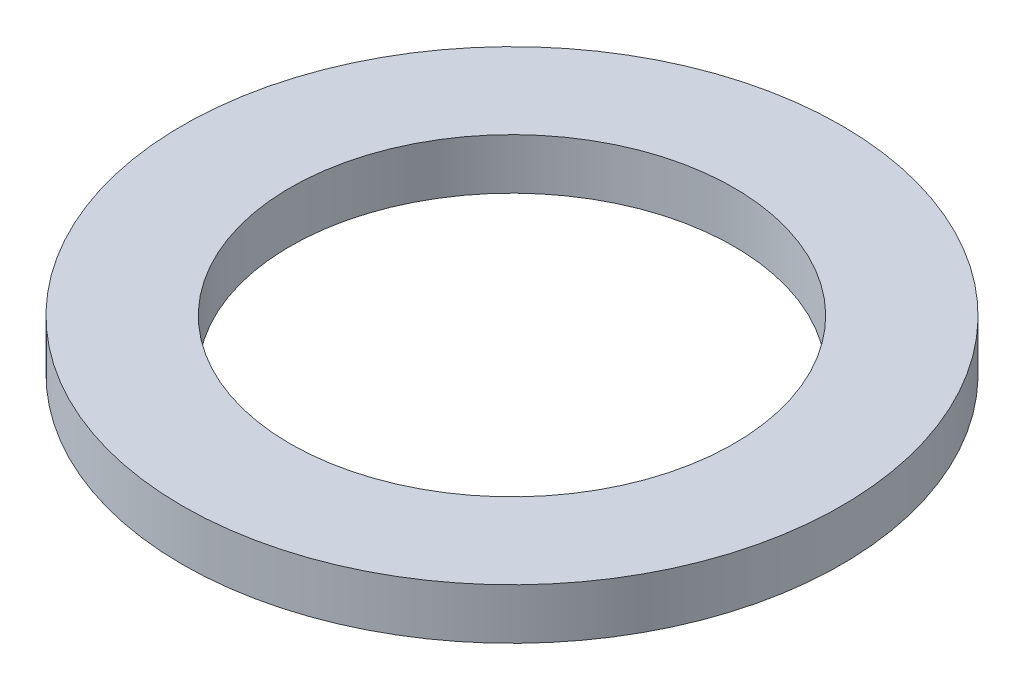
ISO-10303-21;
HEADER;
FILE_DESCRIPTION(('STEP AP214'),'2;1');
FILE_NAME('part.step','',(''),(''),'','','');
FILE_SCHEMA(('AUTOMOTIVE_DESIGN { 1 0 10303 214 1 1 1 1 }'));
ENDSEC;
DATA;
#1=APPLICATION_CONTEXT('core data for automotive mechanical design processes');
#2=APPLICATION_PROTOCOL_DEFINITION('international standard','automotive_design',2000,#1);
#3=PRODUCT_CONTEXT('',#1,'mechanical');
#4=PRODUCT('Part','Part','',(#3));
#5=PRODUCT_RELATED_PRODUCT_CATEGORY('part','',(#4));
#6=PRODUCT_DEFINITION_FORMATION('','',#4);
#7=PRODUCT_DEFINITION_CONTEXT('part definition',#1,'design');
#8=PRODUCT_DEFINITION('design','',#6,#7);
#9=PRODUCT_DEFINITION_SHAPE('','',#8);
#10=(LENGTH_UNIT() NAMED_UNIT(*) SI_UNIT(.MILLI.,.METRE.));
#11=(NAMED_UNIT(*) PLANE_ANGLE_UNIT() SI_UNIT($,.RADIAN.));
#12=(NAMED_UNIT(*) SI_UNIT($,.STERADIAN.) SOLID_ANGLE_UNIT());
#13=UNCERTAINTY_MEASURE_WITH_UNIT(LENGTH_MEASURE(1.E-05),#10,'distance_accuracy_value','');
#14=(GEOMETRIC_REPRESENTATION_CONTEXT(3) GLOBAL_UNCERTAINTY_ASSIGNED_CONTEXT((#13)) GLOBAL_UNIT_ASSIGNED_CONTEXT((#10,
#11,#12)) REPRESENTATION_CONTEXT('',''));
#15=CARTESIAN_POINT('',(0.,0.,0.));
#16=DIRECTION('',(0.,0.,1.));
#17=DIRECTION('',(1.,0.,0.));
#18=AXIS2_PLACEMENT_3D('',#15,#16,#17);
#19=CARTESIAN_POINT('',(0.,4.,0.));
#20=DIRECTION('',(0.,1.,0.));
#21=DIRECTION('',(0.,0.,1.));
#22=AXIS2_PLACEMENT_3D('',#19,#20,#21);
#23=PLANE('',#22);
#24=CARTESIAN_POINT('',(0.,4.,0.));
#25=DIRECTION('',(0.,1.,0.));
#26=DIRECTION('',(0.,0.,1.));
#27=AXIS2_PLACEMENT_3D('',#24,#25,#26);
#28=CIRCLE('',#27,26.);
#29=CARTESIAN_POINT('',(0.,4.,26.));
#30=VERTEX_POINT('',#29);
#31=EDGE_CURVE('E10',#30,#30,#28,.T.);
#32=ORIENTED_EDGE('',*,*,#31,.T.);
#33=EDGE_LOOP('',(#32));
#34=FACE_BOUND('',#33,.T.);
#35=CARTESIAN_POINT('',(0.,4.,0.));
#36=DIRECTION('',(0.,1.,0.));
#37=DIRECTION('',(0.,0.,1.));
#38=AXIS2_PLACEMENT_3D('',#35,#36,#37);
#39=CIRCLE('',#38,17.5);
#40=CARTESIAN_POINT('',(0.,4.,17.5));
#41=VERTEX_POINT('',#40);
#42=EDGE_CURVE('E56',#41,#41,#39,.T.);
#43=ORIENTED_EDGE('',*,*,#42,.F.);
#44=EDGE_LOOP('',(#43));
#45=FACE_BOUND('',#44,.T.);
#46=ADVANCED_FACE('F43',(#34,#45),#23,.T.);
#47=CARTESIAN_POINT('',(0.,0.,0.));
#48=DIRECTION('',(0.,1.,0.));
#49=DIRECTION('',(0.,0.,1.));
#50=AXIS2_PLACEMENT_3D('',#47,#48,#49);
#51=PLANE('',#50);
#52=CARTESIAN_POINT('',(0.,0.,0.));
#53=DIRECTION('',(0.,1.,0.));
#54=DIRECTION('',(0.,0.,1.));
#55=AXIS2_PLACEMENT_3D('',#52,#53,#54);
#56=CIRCLE('',#55,26.);
#57=CARTESIAN_POINT('',(0.,0.,26.));
#58=VERTEX_POINT('',#57);
#59=EDGE_CURVE('E47',#58,#58,#56,.T.);
#60=ORIENTED_EDGE('',*,*,#59,.F.);
#61=EDGE_LOOP('',(#60));
#62=FACE_BOUND('',#61,.T.);
#63=CARTESIAN_POINT('',(0.,0.,0.));
#64=DIRECTION('',(0.,1.,0.));
#65=DIRECTION('',(0.,0.,1.));
#66=AXIS2_PLACEMENT_3D('',#63,#64,#65);
#67=CIRCLE('',#66,17.5);
#68=CARTESIAN_POINT('',(0.,0.,17.5));
#69=VERTEX_POINT('',#68);
#70=EDGE_CURVE('E58',#69,#69,#67,.T.);
#71=ORIENTED_EDGE('',*,*,#70,.T.);
#72=EDGE_LOOP('',(#71));
#73=FACE_BOUND('',#72,.T.);
#74=ADVANCED_FACE('F70',(#62,#73),#51,.F.);
#75=CARTESIAN_POINT('',(0.,4.,0.));
#76=DIRECTION('',(0.,-1.,0.));
#77=DIRECTION('',(0.,0.,-1.));
#78=AXIS2_PLACEMENT_3D('',#75,#76,#77);
#79=CYLINDRICAL_SURFACE('',#78,26.);
#80=ORIENTED_EDGE('',*,*,#31,.F.);
#81=EDGE_LOOP('',(#80));
#82=FACE_BOUND('',#81,.T.);
#83=ORIENTED_EDGE('',*,*,#59,.T.);
#84=EDGE_LOOP('',(#83));
#85=FACE_BOUND('',#84,.T.);
#86=ADVANCED_FACE('F45',(#82,#85),#79,.T.);
#87=CARTESIAN_POINT('',(0.,4.,0.));
#88=DIRECTION('',(0.,-1.,0.));
#89=DIRECTION('',(0.,0.,-1.));
#90=AXIS2_PLACEMENT_3D('',#87,#88,#89);
#91=CYLINDRICAL_SURFACE('',#90,17.5);
#92=ORIENTED_EDGE('',*,*,#42,.T.);
#93=EDGE_LOOP('',(#92));
#94=FACE_BOUND('',#93,.T.);
#95=ORIENTED_EDGE('',*,*,#70,.F.);
#96=EDGE_LOOP('',(#95));
#97=FACE_BOUND('',#96,.T.);
#98=ADVANCED_FACE('F66',(#94,#97),#91,.F.);
#99=CLOSED_SHELL('',(#46,#74,#86,#98));
#100=MANIFOLD_SOLID_BREP('B2',#99);
#101=ADVANCED_BREP_SHAPE_REPRESENTATION('',(#18,#100),#14);
#102=SHAPE_DEFINITION_REPRESENTATION(#9,#101);
ENDSEC;
END-ISO-10303-21;
